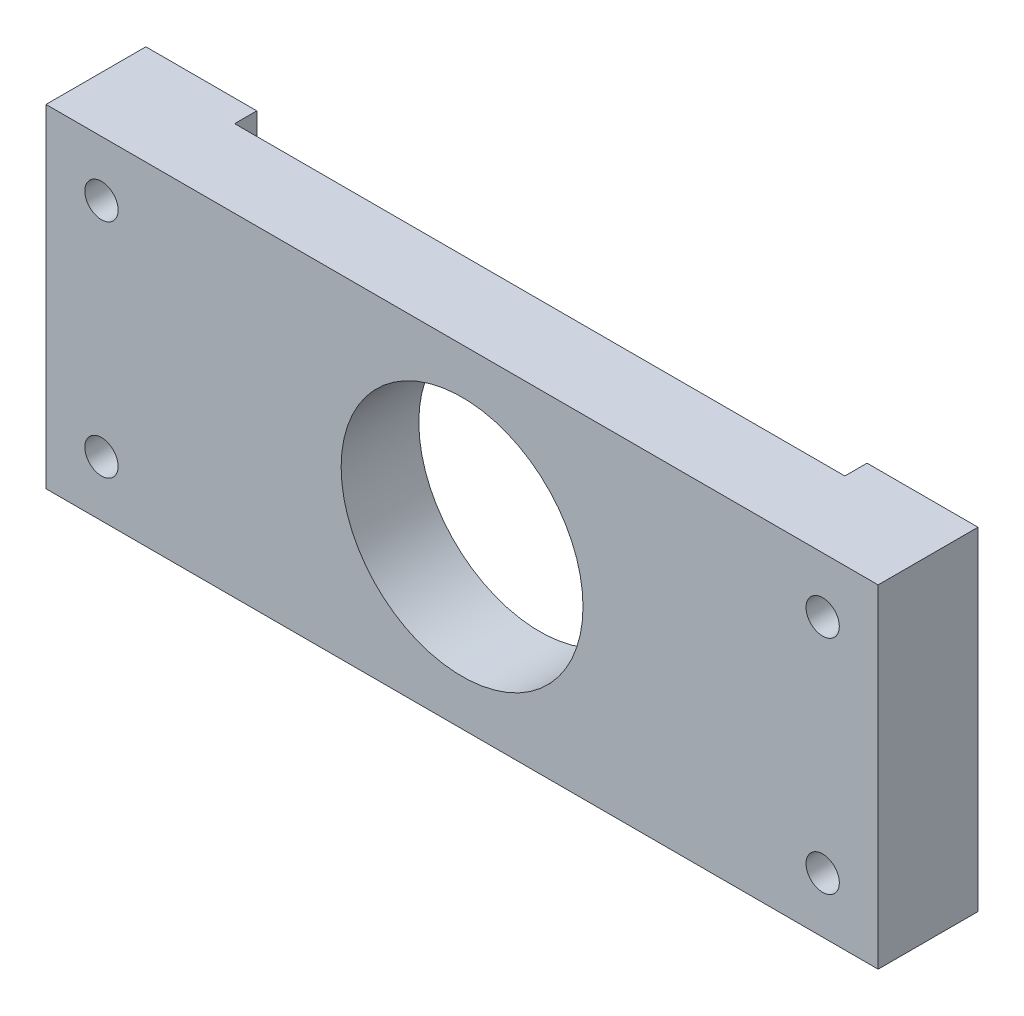
ISO-10303-21;
HEADER;
FILE_DESCRIPTION(('STEP AP214'),'2;1');
FILE_NAME('part.step','',(''),(''),'','','');
FILE_SCHEMA(('AUTOMOTIVE_DESIGN { 1 0 10303 214 1 1 1 1 }'));
ENDSEC;
DATA;
#1=APPLICATION_CONTEXT('core data for automotive mechanical design processes');
#2=APPLICATION_PROTOCOL_DEFINITION('international standard','automotive_design',2000,#1);
#3=PRODUCT_CONTEXT('',#1,'mechanical');
#4=PRODUCT('Part','Part','',(#3));
#5=PRODUCT_RELATED_PRODUCT_CATEGORY('part','',(#4));
#6=PRODUCT_DEFINITION_FORMATION('','',#4);
#7=PRODUCT_DEFINITION_CONTEXT('part definition',#1,'design');
#8=PRODUCT_DEFINITION('design','',#6,#7);
#9=PRODUCT_DEFINITION_SHAPE('','',#8);
#10=(LENGTH_UNIT() NAMED_UNIT(*) SI_UNIT(.MILLI.,.METRE.));
#11=(NAMED_UNIT(*) PLANE_ANGLE_UNIT() SI_UNIT($,.RADIAN.));
#12=(NAMED_UNIT(*) SI_UNIT($,.STERADIAN.) SOLID_ANGLE_UNIT());
#13=UNCERTAINTY_MEASURE_WITH_UNIT(LENGTH_MEASURE(1.E-05),#10,'distance_accuracy_value','');
#14=(GEOMETRIC_REPRESENTATION_CONTEXT(3) GLOBAL_UNCERTAINTY_ASSIGNED_CONTEXT((#13)) GLOBAL_UNIT_ASSIGNED_CONTEXT((#10,
#11,#12)) REPRESENTATION_CONTEXT('',''));
#15=CARTESIAN_POINT('',(0.,0.,0.));
#16=DIRECTION('',(0.,0.,1.));
#17=DIRECTION('',(1.,0.,0.));
#18=AXIS2_PLACEMENT_3D('',#15,#16,#17);
#19=CARTESIAN_POINT('',(0.,0.,7.));
#20=DIRECTION('',(0.,0.,1.));
#21=DIRECTION('',(1.,0.,0.));
#22=AXIS2_PLACEMENT_3D('',#19,#20,#21);
#23=PLANE('',#22);
#24=CARTESIAN_POINT('',(32.5,10.,7.));
#25=DIRECTION('',(0.,0.,-1.));
#26=DIRECTION('',(-1.,0.,0.));
#27=AXIS2_PLACEMENT_3D('',#24,#25,#26);
#28=CIRCLE('',#27,1.5);
#29=CARTESIAN_POINT('',(34.,10.,7.));
#30=VERTEX_POINT('',#29);
#31=EDGE_CURVE('E147',#30,#30,#28,.T.);
#32=ORIENTED_EDGE('',*,*,#31,.T.);
#33=EDGE_LOOP('',(#32));
#34=FACE_BOUND('',#33,.T.);
#35=CARTESIAN_POINT('',(-32.5,-10.,7.));
#36=DIRECTION('',(0.,0.,-1.));
#37=DIRECTION('',(-1.,0.,0.));
#38=AXIS2_PLACEMENT_3D('',#35,#36,#37);
#39=CIRCLE('',#38,1.5);
#40=CARTESIAN_POINT('',(-31.,-10.,7.));
#41=VERTEX_POINT('',#40);
#42=EDGE_CURVE('E188',#41,#41,#39,.T.);
#43=ORIENTED_EDGE('',*,*,#42,.T.);
#44=EDGE_LOOP('',(#43));
#45=FACE_BOUND('',#44,.T.);
#46=CARTESIAN_POINT('',(32.5,-10.,7.));
#47=DIRECTION('',(0.,0.,-1.));
#48=DIRECTION('',(-1.,0.,0.));
#49=AXIS2_PLACEMENT_3D('',#46,#47,#48);
#50=CIRCLE('',#49,1.5);
#51=CARTESIAN_POINT('',(34.,-10.,7.));
#52=VERTEX_POINT('',#51);
#53=EDGE_CURVE('E184',#52,#52,#50,.T.);
#54=ORIENTED_EDGE('',*,*,#53,.T.);
#55=EDGE_LOOP('',(#54));
#56=FACE_BOUND('',#55,.T.);
#57=CARTESIAN_POINT('',(-32.5,10.,7.));
#58=DIRECTION('',(0.,0.,-1.));
#59=DIRECTION('',(-1.,0.,0.));
#60=AXIS2_PLACEMENT_3D('',#57,#58,#59);
#61=CIRCLE('',#60,1.5);
#62=CARTESIAN_POINT('',(-31.,10.,7.));
#63=VERTEX_POINT('',#62);
#64=EDGE_CURVE('E165',#63,#63,#61,.T.);
#65=ORIENTED_EDGE('',*,*,#64,.T.);
#66=EDGE_LOOP('',(#65));
#67=FACE_BOUND('',#66,.T.);
#68=CARTESIAN_POINT('',(0.,0.,7.));
#69=DIRECTION('',(0.,0.,-1.));
#70=DIRECTION('',(1.,0.,0.));
#71=AXIS2_PLACEMENT_3D('',#68,#69,#70);
#72=CIRCLE('',#71,10.9);
#73=CARTESIAN_POINT('',(-10.9,0.,7.));
#74=VERTEX_POINT('',#73);
#75=EDGE_CURVE('E260',#74,#74,#72,.T.);
#76=ORIENTED_EDGE('',*,*,#75,.T.);
#77=EDGE_LOOP('',(#76));
#78=FACE_BOUND('',#77,.T.);
#79=DIRECTION('',(-1.,0.,0.));
#80=VECTOR('',#79,1.);
#81=CARTESIAN_POINT('',(-37.5,15.,7.));
#82=LINE('',#81,#80);
#83=CARTESIAN_POINT('',(37.5,15.,7.));
#84=VERTEX_POINT('',#83);
#85=CARTESIAN_POINT('',(-37.5,15.,7.));
#86=VERTEX_POINT('',#85);
#87=EDGE_CURVE('E11',#84,#86,#82,.T.);
#88=ORIENTED_EDGE('',*,*,#87,.T.);
#89=DIRECTION('',(0.,-1.,0.));
#90=VECTOR('',#89,1.);
#91=CARTESIAN_POINT('',(-37.5,-15.,7.));
#92=LINE('',#91,#90);
#93=CARTESIAN_POINT('',(-37.5,-15.,7.));
#94=VERTEX_POINT('',#93);
#95=EDGE_CURVE('E43',#86,#94,#92,.T.);
#96=ORIENTED_EDGE('',*,*,#95,.T.);
#97=DIRECTION('',(1.,0.,0.));
#98=VECTOR('',#97,1.);
#99=CARTESIAN_POINT('',(37.5,-15.,7.));
#100=LINE('',#99,#98);
#101=CARTESIAN_POINT('',(37.5,-15.,7.));
#102=VERTEX_POINT('',#101);
#103=EDGE_CURVE('E205',#94,#102,#100,.T.);
#104=ORIENTED_EDGE('',*,*,#103,.T.);
#105=DIRECTION('',(0.,1.,0.));
#106=VECTOR('',#105,1.);
#107=CARTESIAN_POINT('',(37.5,15.,7.));
#108=LINE('',#107,#106);
#109=EDGE_CURVE('E270',#102,#84,#108,.T.);
#110=ORIENTED_EDGE('',*,*,#109,.T.);
#111=EDGE_LOOP('',(#88,#96,#104,#110));
#112=FACE_BOUND('',#111,.T.);
#113=ADVANCED_FACE('F17',(#34,#45,#56,#67,#78,#112),#23,.T.);
#114=CARTESIAN_POINT('',(37.5,15.,0.));
#115=DIRECTION('',(0.,1.,0.));
#116=DIRECTION('',(1.,0.,0.));
#117=AXIS2_PLACEMENT_3D('',#114,#115,#116);
#118=PLANE('',#117);
#119=DIRECTION('',(0.,0.,1.));
#120=VECTOR('',#119,1.);
#121=CARTESIAN_POINT('',(-37.5,15.,0.));
#122=LINE('',#121,#120);
#123=CARTESIAN_POINT('',(-37.5,15.,-2.));
#124=VERTEX_POINT('',#123);
#125=EDGE_CURVE('E26',#124,#86,#122,.T.);
#126=ORIENTED_EDGE('',*,*,#125,.T.);
#127=ORIENTED_EDGE('',*,*,#87,.F.);
#128=DIRECTION('',(0.,0.,-1.));
#129=VECTOR('',#128,1.);
#130=CARTESIAN_POINT('',(37.5,15.,0.));
#131=LINE('',#130,#129);
#132=CARTESIAN_POINT('',(37.5,15.,-2.));
#133=VERTEX_POINT('',#132);
#134=EDGE_CURVE('E267',#84,#133,#131,.T.);
#135=ORIENTED_EDGE('',*,*,#134,.T.);
#136=DIRECTION('',(1.,0.,0.));
#137=VECTOR('',#136,1.);
#138=CARTESIAN_POINT('',(27.5,15.,-2.));
#139=LINE('',#138,#137);
#140=CARTESIAN_POINT('',(27.5,15.,-2.));
#141=VERTEX_POINT('',#140);
#142=EDGE_CURVE('E220',#141,#133,#139,.T.);
#143=ORIENTED_EDGE('',*,*,#142,.F.);
#144=DIRECTION('',(0.,0.,-1.));
#145=VECTOR('',#144,1.);
#146=CARTESIAN_POINT('',(27.5,15.,0.));
#147=LINE('',#146,#145);
#148=CARTESIAN_POINT('',(27.5,15.,0.));
#149=VERTEX_POINT('',#148);
#150=EDGE_CURVE('E195',#149,#141,#147,.T.);
#151=ORIENTED_EDGE('',*,*,#150,.F.);
#152=DIRECTION('',(1.,0.,0.));
#153=VECTOR('',#152,1.);
#154=CARTESIAN_POINT('',(-37.5,15.,0.));
#155=LINE('',#154,#153);
#156=CARTESIAN_POINT('',(-27.5,15.,0.));
#157=VERTEX_POINT('',#156);
#158=EDGE_CURVE('E253',#157,#149,#155,.T.);
#159=ORIENTED_EDGE('',*,*,#158,.F.);
#160=DIRECTION('',(0.,0.,-1.));
#161=VECTOR('',#160,1.);
#162=CARTESIAN_POINT('',(-27.5,15.,0.));
#163=LINE('',#162,#161);
#164=CARTESIAN_POINT('',(-27.5,15.,-2.));
#165=VERTEX_POINT('',#164);
#166=EDGE_CURVE('E236',#157,#165,#163,.T.);
#167=ORIENTED_EDGE('',*,*,#166,.T.);
#168=DIRECTION('',(1.,0.,0.));
#169=VECTOR('',#168,1.);
#170=CARTESIAN_POINT('',(-27.5,15.,-2.));
#171=LINE('',#170,#169);
#172=EDGE_CURVE('E242',#124,#165,#171,.T.);
#173=ORIENTED_EDGE('',*,*,#172,.F.);
#174=EDGE_LOOP('',(#126,#127,#135,#143,#151,#159,#167,#173));
#175=FACE_BOUND('',#174,.T.);
#176=ADVANCED_FACE('F283',(#175),#118,.T.);
#177=CARTESIAN_POINT('',(-37.5,15.,0.));
#178=DIRECTION('',(-1.,0.,0.));
#179=DIRECTION('',(0.,1.,0.));
#180=AXIS2_PLACEMENT_3D('',#177,#178,#179);
#181=PLANE('',#180);
#182=DIRECTION('',(0.,0.,1.));
#183=VECTOR('',#182,1.);
#184=CARTESIAN_POINT('',(-37.5,-15.,0.));
#185=LINE('',#184,#183);
#186=CARTESIAN_POINT('',(-37.5,-15.,-2.));
#187=VERTEX_POINT('',#186);
#188=EDGE_CURVE('E202',#187,#94,#185,.T.);
#189=ORIENTED_EDGE('',*,*,#188,.T.);
#190=ORIENTED_EDGE('',*,*,#95,.F.);
#191=ORIENTED_EDGE('',*,*,#125,.F.);
#192=DIRECTION('',(0.,1.,0.));
#193=VECTOR('',#192,1.);
#194=CARTESIAN_POINT('',(-37.5,15.,-2.));
#195=LINE('',#194,#193);
#196=EDGE_CURVE('E246',#187,#124,#195,.T.);
#197=ORIENTED_EDGE('',*,*,#196,.F.);
#198=EDGE_LOOP('',(#189,#190,#191,#197));
#199=FACE_BOUND('',#198,.T.);
#200=ADVANCED_FACE('F19',(#199),#181,.T.);
#201=CARTESIAN_POINT('',(-37.5,-15.,0.));
#202=DIRECTION('',(0.,-1.,0.));
#203=DIRECTION('',(0.,0.,-1.));
#204=AXIS2_PLACEMENT_3D('',#201,#202,#203);
#205=PLANE('',#204);
#206=DIRECTION('',(0.,0.,1.));
#207=VECTOR('',#206,1.);
#208=CARTESIAN_POINT('',(37.5,-15.,0.));
#209=LINE('',#208,#207);
#210=CARTESIAN_POINT('',(37.5,-15.,-2.));
#211=VERTEX_POINT('',#210);
#212=EDGE_CURVE('E273',#211,#102,#209,.T.);
#213=ORIENTED_EDGE('',*,*,#212,.T.);
#214=ORIENTED_EDGE('',*,*,#103,.F.);
#215=ORIENTED_EDGE('',*,*,#188,.F.);
#216=DIRECTION('',(-1.,0.,0.));
#217=VECTOR('',#216,1.);
#218=CARTESIAN_POINT('',(-37.5,-15.,-2.));
#219=LINE('',#218,#217);
#220=CARTESIAN_POINT('',(-27.5,-15.,-2.));
#221=VERTEX_POINT('',#220);
#222=EDGE_CURVE('E245',#221,#187,#219,.T.);
#223=ORIENTED_EDGE('',*,*,#222,.F.);
#224=DIRECTION('',(0.,0.,-1.));
#225=VECTOR('',#224,1.);
#226=CARTESIAN_POINT('',(-27.5,-15.,0.));
#227=LINE('',#226,#225);
#228=CARTESIAN_POINT('',(-27.5,-15.,0.));
#229=VERTEX_POINT('',#228);
#230=EDGE_CURVE('E228',#229,#221,#227,.T.);
#231=ORIENTED_EDGE('',*,*,#230,.F.);
#232=DIRECTION('',(-1.,0.,0.));
#233=VECTOR('',#232,1.);
#234=CARTESIAN_POINT('',(37.5,-15.,0.));
#235=LINE('',#234,#233);
#236=CARTESIAN_POINT('',(27.5,-15.,0.));
#237=VERTEX_POINT('',#236);
#238=EDGE_CURVE('E250',#237,#229,#235,.T.);
#239=ORIENTED_EDGE('',*,*,#238,.F.);
#240=DIRECTION('',(0.,0.,-1.));
#241=VECTOR('',#240,1.);
#242=CARTESIAN_POINT('',(27.5,-15.,0.));
#243=LINE('',#242,#241);
#244=CARTESIAN_POINT('',(27.5,-15.,-2.));
#245=VERTEX_POINT('',#244);
#246=EDGE_CURVE('E168',#237,#245,#243,.T.);
#247=ORIENTED_EDGE('',*,*,#246,.T.);
#248=DIRECTION('',(-1.,0.,0.));
#249=VECTOR('',#248,1.);
#250=CARTESIAN_POINT('',(37.5,-15.,-2.));
#251=LINE('',#250,#249);
#252=EDGE_CURVE('E217',#211,#245,#251,.T.);
#253=ORIENTED_EDGE('',*,*,#252,.F.);
#254=EDGE_LOOP('',(#213,#214,#215,#223,#231,#239,#247,#253));
#255=FACE_BOUND('',#254,.T.);
#256=ADVANCED_FACE('F289',(#255),#205,.T.);
#257=CARTESIAN_POINT('',(37.5,-15.,0.));
#258=DIRECTION('',(1.,0.,0.));
#259=DIRECTION('',(0.,-1.,0.));
#260=AXIS2_PLACEMENT_3D('',#257,#258,#259);
#261=PLANE('',#260);
#262=ORIENTED_EDGE('',*,*,#134,.F.);
#263=ORIENTED_EDGE('',*,*,#109,.F.);
#264=ORIENTED_EDGE('',*,*,#212,.F.);
#265=DIRECTION('',(0.,-1.,0.));
#266=VECTOR('',#265,1.);
#267=CARTESIAN_POINT('',(37.5,15.,-2.));
#268=LINE('',#267,#266);
#269=EDGE_CURVE('E172',#133,#211,#268,.T.);
#270=ORIENTED_EDGE('',*,*,#269,.F.);
#271=EDGE_LOOP('',(#262,#263,#264,#270));
#272=FACE_BOUND('',#271,.T.);
#273=ADVANCED_FACE('F295',(#272),#261,.T.);
#274=CARTESIAN_POINT('',(0.,0.,0.));
#275=DIRECTION('',(0.,0.,1.));
#276=DIRECTION('',(1.,0.,0.));
#277=AXIS2_PLACEMENT_3D('',#274,#275,#276);
#278=CYLINDRICAL_SURFACE('',#277,10.9);
#279=ORIENTED_EDGE('',*,*,#75,.F.);
#280=DIRECTION('',(0.,0.,-1.));
#281=VECTOR('',#280,1.);
#282=CARTESIAN_POINT('',(-10.9,0.,0.));
#283=LINE('',#282,#281);
#284=CARTESIAN_POINT('',(-10.9,0.,0.));
#285=VERTEX_POINT('',#284);
#286=EDGE_CURVE('E264',#74,#285,#283,.T.);
#287=ORIENTED_EDGE('',*,*,#286,.T.);
#288=CARTESIAN_POINT('',(0.,0.,0.));
#289=DIRECTION('',(0.,0.,-1.));
#290=DIRECTION('',(1.,0.,0.));
#291=AXIS2_PLACEMENT_3D('',#288,#289,#290);
#292=CIRCLE('',#291,10.9);
#293=EDGE_CURVE('E256',#285,#285,#292,.T.);
#294=ORIENTED_EDGE('',*,*,#293,.T.);
#295=ORIENTED_EDGE('',*,*,#286,.F.);
#296=EDGE_LOOP('',(#279,#287,#294,#295));
#297=FACE_BOUND('',#296,.T.);
#298=ADVANCED_FACE('F322',(#297),#278,.F.);
#299=CARTESIAN_POINT('',(0.,0.,0.));
#300=DIRECTION('',(0.,0.,1.));
#301=DIRECTION('',(1.,0.,0.));
#302=AXIS2_PLACEMENT_3D('',#299,#300,#301);
#303=PLANE('',#302);
#304=ORIENTED_EDGE('',*,*,#293,.F.);
#305=EDGE_LOOP('',(#304));
#306=FACE_BOUND('',#305,.T.);
#307=DIRECTION('',(0.,-1.,0.));
#308=VECTOR('',#307,1.);
#309=CARTESIAN_POINT('',(27.5,-7.5,0.));
#310=LINE('',#309,#308);
#311=EDGE_CURVE('E191',#149,#237,#310,.T.);
#312=ORIENTED_EDGE('',*,*,#311,.T.);
#313=ORIENTED_EDGE('',*,*,#238,.T.);
#314=DIRECTION('',(0.,1.,0.));
#315=VECTOR('',#314,1.);
#316=CARTESIAN_POINT('',(-27.5,7.5,0.));
#317=LINE('',#316,#315);
#318=EDGE_CURVE('E224',#229,#157,#317,.T.);
#319=ORIENTED_EDGE('',*,*,#318,.T.);
#320=ORIENTED_EDGE('',*,*,#158,.T.);
#321=EDGE_LOOP('',(#312,#313,#319,#320));
#322=FACE_BOUND('',#321,.T.);
#323=ADVANCED_FACE('F308',(#306,#322),#303,.F.);
#324=CARTESIAN_POINT('',(-32.5,0.,-2.));
#325=DIRECTION('',(0.,0.,-1.));
#326=DIRECTION('',(0.,-1.,0.));
#327=AXIS2_PLACEMENT_3D('',#324,#325,#326);
#328=PLANE('',#327);
#329=CARTESIAN_POINT('',(-32.5,10.,-2.));
#330=DIRECTION('',(0.,0.,1.));
#331=DIRECTION('',(-1.,0.,0.));
#332=AXIS2_PLACEMENT_3D('',#329,#330,#331);
#333=CIRCLE('',#332,1.5);
#334=CARTESIAN_POINT('',(-31.,10.,-2.));
#335=VERTEX_POINT('',#334);
#336=EDGE_CURVE('E166',#335,#335,#333,.T.);
#337=ORIENTED_EDGE('',*,*,#336,.T.);
#338=EDGE_LOOP('',(#337));
#339=FACE_BOUND('',#338,.T.);
#340=CARTESIAN_POINT('',(-32.5,-10.,-2.));
#341=DIRECTION('',(0.,0.,1.));
#342=DIRECTION('',(-1.,0.,0.));
#343=AXIS2_PLACEMENT_3D('',#340,#341,#342);
#344=CIRCLE('',#343,1.5);
#345=CARTESIAN_POINT('',(-31.,-10.,-2.));
#346=VERTEX_POINT('',#345);
#347=EDGE_CURVE('E176',#346,#346,#344,.T.);
#348=ORIENTED_EDGE('',*,*,#347,.T.);
#349=EDGE_LOOP('',(#348));
#350=FACE_BOUND('',#349,.T.);
#351=ORIENTED_EDGE('',*,*,#172,.T.);
#352=DIRECTION('',(0.,-1.,0.));
#353=VECTOR('',#352,1.);
#354=CARTESIAN_POINT('',(-27.5,-15.,-2.));
#355=LINE('',#354,#353);
#356=EDGE_CURVE('E232',#165,#221,#355,.T.);
#357=ORIENTED_EDGE('',*,*,#356,.T.);
#358=ORIENTED_EDGE('',*,*,#222,.T.);
#359=ORIENTED_EDGE('',*,*,#196,.T.);
#360=EDGE_LOOP('',(#351,#357,#358,#359));
#361=FACE_BOUND('',#360,.T.);
#362=ADVANCED_FACE('F312',(#339,#350,#361),#328,.T.);
#363=CARTESIAN_POINT('',(-27.5,15.,0.));
#364=DIRECTION('',(1.,0.,0.));
#365=DIRECTION('',(0.,1.,0.));
#366=AXIS2_PLACEMENT_3D('',#363,#364,#365);
#367=PLANE('',#366);
#368=ORIENTED_EDGE('',*,*,#318,.F.);
#369=ORIENTED_EDGE('',*,*,#230,.T.);
#370=ORIENTED_EDGE('',*,*,#356,.F.);
#371=ORIENTED_EDGE('',*,*,#166,.F.);
#372=EDGE_LOOP('',(#368,#369,#370,#371));
#373=FACE_BOUND('',#372,.T.);
#374=ADVANCED_FACE('F307',(#373),#367,.T.);
#375=CARTESIAN_POINT('',(32.5,0.,-2.));
#376=DIRECTION('',(0.,0.,-1.));
#377=DIRECTION('',(0.,-1.,0.));
#378=AXIS2_PLACEMENT_3D('',#375,#376,#377);
#379=PLANE('',#378);
#380=CARTESIAN_POINT('',(32.5,-10.,-2.));
#381=DIRECTION('',(0.,0.,1.));
#382=DIRECTION('',(-1.,0.,0.));
#383=AXIS2_PLACEMENT_3D('',#380,#381,#382);
#384=CIRCLE('',#383,1.5);
#385=CARTESIAN_POINT('',(34.,-10.,-2.));
#386=VERTEX_POINT('',#385);
#387=EDGE_CURVE('E160',#386,#386,#384,.T.);
#388=ORIENTED_EDGE('',*,*,#387,.T.);
#389=EDGE_LOOP('',(#388));
#390=FACE_BOUND('',#389,.T.);
#391=CARTESIAN_POINT('',(32.5,10.,-2.));
#392=DIRECTION('',(0.,0.,1.));
#393=DIRECTION('',(-1.,0.,0.));
#394=AXIS2_PLACEMENT_3D('',#391,#392,#393);
#395=CIRCLE('',#394,1.5);
#396=CARTESIAN_POINT('',(34.,10.,-2.));
#397=VERTEX_POINT('',#396);
#398=EDGE_CURVE('E146',#397,#397,#395,.T.);
#399=ORIENTED_EDGE('',*,*,#398,.T.);
#400=EDGE_LOOP('',(#399));
#401=FACE_BOUND('',#400,.T.);
#402=ORIENTED_EDGE('',*,*,#269,.T.);
#403=ORIENTED_EDGE('',*,*,#252,.T.);
#404=DIRECTION('',(0.,1.,0.));
#405=VECTOR('',#404,1.);
#406=CARTESIAN_POINT('',(27.5,-15.,-2.));
#407=LINE('',#406,#405);
#408=EDGE_CURVE('E173',#245,#141,#407,.T.);
#409=ORIENTED_EDGE('',*,*,#408,.T.);
#410=ORIENTED_EDGE('',*,*,#142,.T.);
#411=EDGE_LOOP('',(#402,#403,#409,#410));
#412=FACE_BOUND('',#411,.T.);
#413=ADVANCED_FACE('F151',(#390,#401,#412),#379,.T.);
#414=CARTESIAN_POINT('',(27.5,-15.,0.));
#415=DIRECTION('',(-1.,0.,0.));
#416=DIRECTION('',(0.,0.,1.));
#417=AXIS2_PLACEMENT_3D('',#414,#415,#416);
#418=PLANE('',#417);
#419=ORIENTED_EDGE('',*,*,#311,.F.);
#420=ORIENTED_EDGE('',*,*,#150,.T.);
#421=ORIENTED_EDGE('',*,*,#408,.F.);
#422=ORIENTED_EDGE('',*,*,#246,.F.);
#423=EDGE_LOOP('',(#419,#420,#421,#422));
#424=FACE_BOUND('',#423,.T.);
#425=ADVANCED_FACE('F301',(#424),#418,.T.);
#426=CARTESIAN_POINT('',(-32.5,10.,-2.));
#427=DIRECTION('',(0.,0.,1.));
#428=DIRECTION('',(-1.,0.,0.));
#429=AXIS2_PLACEMENT_3D('',#426,#427,#428);
#430=CYLINDRICAL_SURFACE('',#429,1.5);
#431=ORIENTED_EDGE('',*,*,#336,.F.);
#432=DIRECTION('',(0.,0.,1.));
#433=VECTOR('',#432,1.);
#434=CARTESIAN_POINT('',(-31.,10.,-2.));
#435=LINE('',#434,#433);
#436=EDGE_CURVE('E162',#335,#63,#435,.T.);
#437=ORIENTED_EDGE('',*,*,#436,.T.);
#438=ORIENTED_EDGE('',*,*,#64,.F.);
#439=ORIENTED_EDGE('',*,*,#436,.F.);
#440=EDGE_LOOP('',(#431,#437,#438,#439));
#441=FACE_BOUND('',#440,.T.);
#442=ADVANCED_FACE('F395',(#441),#430,.F.);
#443=CARTESIAN_POINT('',(32.5,-10.,-2.));
#444=DIRECTION('',(0.,0.,1.));
#445=DIRECTION('',(-1.,0.,0.));
#446=AXIS2_PLACEMENT_3D('',#443,#444,#445);
#447=CYLINDRICAL_SURFACE('',#446,1.5);
#448=ORIENTED_EDGE('',*,*,#387,.F.);
#449=DIRECTION('',(0.,0.,1.));
#450=VECTOR('',#449,1.);
#451=CARTESIAN_POINT('',(34.,-10.,-2.));
#452=LINE('',#451,#450);
#453=EDGE_CURVE('E196',#386,#52,#452,.T.);
#454=ORIENTED_EDGE('',*,*,#453,.T.);
#455=ORIENTED_EDGE('',*,*,#53,.F.);
#456=ORIENTED_EDGE('',*,*,#453,.F.);
#457=EDGE_LOOP('',(#448,#454,#455,#456));
#458=FACE_BOUND('',#457,.T.);
#459=ADVANCED_FACE('F405',(#458),#447,.F.);
#460=CARTESIAN_POINT('',(-32.5,-10.,-2.));
#461=DIRECTION('',(0.,0.,1.));
#462=DIRECTION('',(-1.,0.,0.));
#463=AXIS2_PLACEMENT_3D('',#460,#461,#462);
#464=CYLINDRICAL_SURFACE('',#463,1.5);
#465=ORIENTED_EDGE('',*,*,#347,.F.);
#466=DIRECTION('',(0.,0.,1.));
#467=VECTOR('',#466,1.);
#468=CARTESIAN_POINT('',(-31.,-10.,-2.));
#469=LINE('',#468,#467);
#470=EDGE_CURVE('E180',#346,#41,#469,.T.);
#471=ORIENTED_EDGE('',*,*,#470,.T.);
#472=ORIENTED_EDGE('',*,*,#42,.F.);
#473=ORIENTED_EDGE('',*,*,#470,.F.);
#474=EDGE_LOOP('',(#465,#471,#472,#473));
#475=FACE_BOUND('',#474,.T.);
#476=ADVANCED_FACE('F416',(#475),#464,.F.);
#477=CARTESIAN_POINT('',(32.5,10.,-2.));
#478=DIRECTION('',(0.,0.,1.));
#479=DIRECTION('',(-1.,0.,0.));
#480=AXIS2_PLACEMENT_3D('',#477,#478,#479);
#481=CYLINDRICAL_SURFACE('',#480,1.5);
#482=ORIENTED_EDGE('',*,*,#398,.F.);
#483=DIRECTION('',(0.,0.,1.));
#484=VECTOR('',#483,1.);
#485=CARTESIAN_POINT('',(34.,10.,-2.));
#486=LINE('',#485,#484);
#487=EDGE_CURVE('E143',#397,#30,#486,.T.);
#488=ORIENTED_EDGE('',*,*,#487,.T.);
#489=ORIENTED_EDGE('',*,*,#31,.F.);
#490=ORIENTED_EDGE('',*,*,#487,.F.);
#491=EDGE_LOOP('',(#482,#488,#489,#490));
#492=FACE_BOUND('',#491,.T.);
#493=ADVANCED_FACE('F145',(#492),#481,.F.);
#494=CLOSED_SHELL('',(#113,#176,#200,#256,#273,#298,#323,#362,#374,#413,#425,#442,#459,#476,#493));
#495=MANIFOLD_SOLID_BREP('B1',#494);
#496=ADVANCED_BREP_SHAPE_REPRESENTATION('',(#18,#495),#14);
#497=SHAPE_DEFINITION_REPRESENTATION(#9,#496);
ENDSEC;
END-ISO-10303-21;
